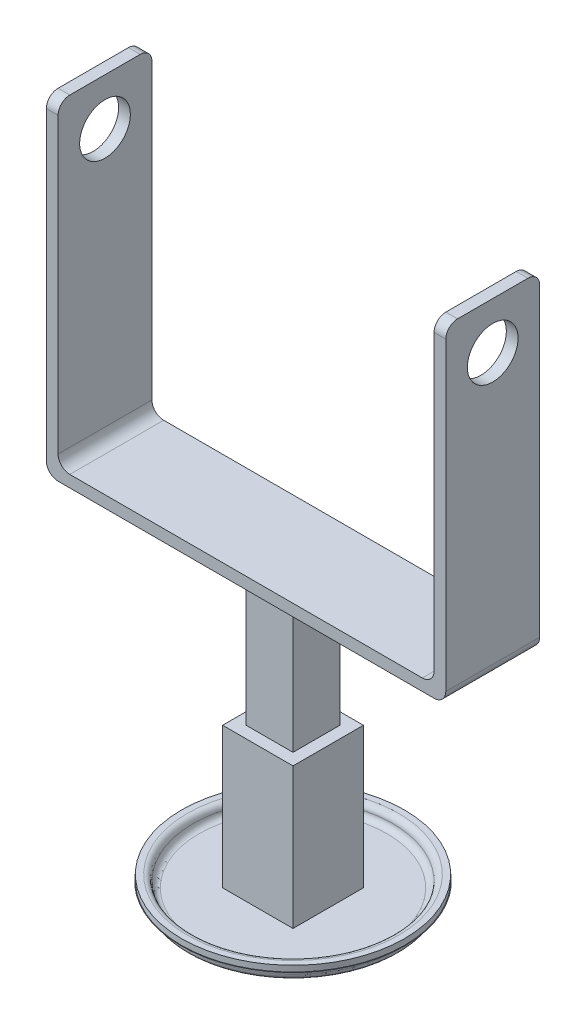
ISO-10303-21;
HEADER;
FILE_DESCRIPTION(('STEP AP214'),'2;1');
FILE_NAME('part.step','',(''),(''),'','','');
FILE_SCHEMA(('AUTOMOTIVE_DESIGN { 1 0 10303 214 1 1 1 1 }'));
ENDSEC;
DATA;
#1=APPLICATION_CONTEXT('core data for automotive mechanical design processes');
#2=APPLICATION_PROTOCOL_DEFINITION('international standard','automotive_design',2000,#1);
#3=PRODUCT_CONTEXT('',#1,'mechanical');
#4=PRODUCT('Part','Part','',(#3));
#5=PRODUCT_RELATED_PRODUCT_CATEGORY('part','',(#4));
#6=PRODUCT_DEFINITION_FORMATION('','',#4);
#7=PRODUCT_DEFINITION_CONTEXT('part definition',#1,'design');
#8=PRODUCT_DEFINITION('design','',#6,#7);
#9=PRODUCT_DEFINITION_SHAPE('','',#8);
#10=(LENGTH_UNIT() NAMED_UNIT(*) SI_UNIT(.MILLI.,.METRE.));
#11=(NAMED_UNIT(*) PLANE_ANGLE_UNIT() SI_UNIT($,.RADIAN.));
#12=(NAMED_UNIT(*) SI_UNIT($,.STERADIAN.) SOLID_ANGLE_UNIT());
#13=UNCERTAINTY_MEASURE_WITH_UNIT(LENGTH_MEASURE(1.E-05),#10,'distance_accuracy_value','');
#14=(GEOMETRIC_REPRESENTATION_CONTEXT(3) GLOBAL_UNCERTAINTY_ASSIGNED_CONTEXT((#13)) GLOBAL_UNIT_ASSIGNED_CONTEXT((#10,
#11,#12)) REPRESENTATION_CONTEXT('',''));
#15=CARTESIAN_POINT('',(0.,0.,0.));
#16=DIRECTION('',(0.,0.,1.));
#17=DIRECTION('',(1.,0.,0.));
#18=AXIS2_PLACEMENT_3D('',#15,#16,#17);
#19=CARTESIAN_POINT('',(0.,79.375,0.));
#20=DIRECTION('',(0.,-1.,0.));
#21=DIRECTION('',(1.,0.,0.));
#22=AXIS2_PLACEMENT_3D('',#19,#20,#21);
#23=PLANE('',#22);
#24=DIRECTION('',(0.,0.,1.));
#25=VECTOR('',#24,1.);
#26=CARTESIAN_POINT('',(-19.0499999999999,79.3750000000001,-19.05));
#27=LINE('',#26,#25);
#28=CARTESIAN_POINT('',(-19.0499999999999,79.3750000000001,-19.05));
#29=VERTEX_POINT('',#28);
#30=CARTESIAN_POINT('',(-19.0499999999999,79.3750000000001,19.05));
#31=VERTEX_POINT('',#30);
#32=EDGE_CURVE('E703',#29,#31,#27,.T.);
#33=ORIENTED_EDGE('',*,*,#32,.T.);
#34=DIRECTION('',(1.,0.,0.));
#35=VECTOR('',#34,1.);
#36=CARTESIAN_POINT('',(19.0500000000001,79.375,19.05));
#37=LINE('',#36,#35);
#38=CARTESIAN_POINT('',(19.0500000000001,79.375,19.05));
#39=VERTEX_POINT('',#38);
#40=EDGE_CURVE('E699',#31,#39,#37,.T.);
#41=ORIENTED_EDGE('',*,*,#40,.T.);
#42=DIRECTION('',(0.,0.,-1.));
#43=VECTOR('',#42,1.);
#44=CARTESIAN_POINT('',(19.0500000000001,79.375,-19.05));
#45=LINE('',#44,#43);
#46=CARTESIAN_POINT('',(19.0500000000001,79.375,-19.05));
#47=VERTEX_POINT('',#46);
#48=EDGE_CURVE('E702',#39,#47,#45,.T.);
#49=ORIENTED_EDGE('',*,*,#48,.T.);
#50=DIRECTION('',(-1.,0.,0.));
#51=VECTOR('',#50,1.);
#52=CARTESIAN_POINT('',(19.0500000000001,79.375,-19.05));
#53=LINE('',#52,#51);
#54=EDGE_CURVE('E707',#47,#29,#53,.T.);
#55=ORIENTED_EDGE('',*,*,#54,.T.);
#56=EDGE_LOOP('',(#33,#41,#49,#55));
#57=FACE_BOUND('',#56,.T.);
#58=DIRECTION('',(0.,0.,1.));
#59=VECTOR('',#58,1.);
#60=CARTESIAN_POINT('',(-12.6999999999999,79.375,-12.7));
#61=LINE('',#60,#59);
#62=CARTESIAN_POINT('',(-12.6999999999999,79.375,-12.7));
#63=VERTEX_POINT('',#62);
#64=CARTESIAN_POINT('',(-12.6999999999999,79.375,12.7));
#65=VERTEX_POINT('',#64);
#66=EDGE_CURVE('E295',#63,#65,#61,.T.);
#67=ORIENTED_EDGE('',*,*,#66,.F.);
#68=DIRECTION('',(-1.,0.,0.));
#69=VECTOR('',#68,1.);
#70=CARTESIAN_POINT('',(12.7000000000001,79.375,-12.7));
#71=LINE('',#70,#69);
#72=CARTESIAN_POINT('',(12.7000000000001,79.375,-12.7));
#73=VERTEX_POINT('',#72);
#74=EDGE_CURVE('E271',#73,#63,#71,.T.);
#75=ORIENTED_EDGE('',*,*,#74,.F.);
#76=DIRECTION('',(0.,0.,-1.));
#77=VECTOR('',#76,1.);
#78=CARTESIAN_POINT('',(12.7000000000001,79.375,-12.7));
#79=LINE('',#78,#77);
#80=CARTESIAN_POINT('',(12.7000000000001,79.375,12.7));
#81=VERTEX_POINT('',#80);
#82=EDGE_CURVE('E751',#81,#73,#79,.T.);
#83=ORIENTED_EDGE('',*,*,#82,.F.);
#84=DIRECTION('',(1.,0.,0.));
#85=VECTOR('',#84,1.);
#86=CARTESIAN_POINT('',(12.7000000000001,79.375,12.7));
#87=LINE('',#86,#85);
#88=EDGE_CURVE('E753',#65,#81,#87,.T.);
#89=ORIENTED_EDGE('',*,*,#88,.F.);
#90=EDGE_LOOP('',(#67,#75,#83,#89));
#91=FACE_BOUND('',#90,.T.);
#92=ADVANCED_FACE('F45',(#57,#91),#23,.F.);
#93=CARTESIAN_POINT('',(50.8,3.17499999999998,0.));
#94=DIRECTION('',(0.,-1.,0.));
#95=DIRECTION('',(1.,0.,0.));
#96=AXIS2_PLACEMENT_3D('',#93,#94,#95);
#97=PLANE('',#96);
#98=CARTESIAN_POINT('',(0.,3.17500000000006,0.));
#99=DIRECTION('',(0.,1.,0.));
#100=DIRECTION('',(-1.,0.,0.));
#101=AXIS2_PLACEMENT_3D('',#98,#99,#100);
#102=CIRCLE('',#101,50.8);
#103=CARTESIAN_POINT('',(-50.8,3.17500000000012,0.));
#104=VERTEX_POINT('',#103);
#105=EDGE_CURVE('E696',#104,#104,#102,.T.);
#106=ORIENTED_EDGE('',*,*,#105,.T.);
#107=EDGE_LOOP('',(#106));
#108=FACE_BOUND('',#107,.T.);
#109=DIRECTION('',(0.,0.,1.));
#110=VECTOR('',#109,1.);
#111=CARTESIAN_POINT('',(-19.05,3.17500000000005,-19.05));
#112=LINE('',#111,#110);
#113=CARTESIAN_POINT('',(-19.05,3.17500000000005,-19.05));
#114=VERTEX_POINT('',#113);
#115=CARTESIAN_POINT('',(-19.05,3.17500000000005,19.05));
#116=VERTEX_POINT('',#115);
#117=EDGE_CURVE('E663',#114,#116,#112,.T.);
#118=ORIENTED_EDGE('',*,*,#117,.F.);
#119=DIRECTION('',(-1.,0.,0.));
#120=VECTOR('',#119,1.);
#121=CARTESIAN_POINT('',(19.05,3.17500000000001,-19.05));
#122=LINE('',#121,#120);
#123=CARTESIAN_POINT('',(19.0500000000001,3.17500000000001,-19.05));
#124=VERTEX_POINT('',#123);
#125=EDGE_CURVE('E670',#124,#114,#122,.T.);
#126=ORIENTED_EDGE('',*,*,#125,.F.);
#127=DIRECTION('',(0.,0.,-1.));
#128=VECTOR('',#127,1.);
#129=CARTESIAN_POINT('',(19.05,3.17500000000001,-19.05));
#130=LINE('',#129,#128);
#131=CARTESIAN_POINT('',(19.05,3.17500000000001,19.05));
#132=VERTEX_POINT('',#131);
#133=EDGE_CURVE('E662',#132,#124,#130,.T.);
#134=ORIENTED_EDGE('',*,*,#133,.F.);
#135=DIRECTION('',(1.,0.,0.));
#136=VECTOR('',#135,1.);
#137=CARTESIAN_POINT('',(19.05,3.17500000000001,19.05));
#138=LINE('',#137,#136);
#139=EDGE_CURVE('E656',#116,#132,#138,.T.);
#140=ORIENTED_EDGE('',*,*,#139,.F.);
#141=EDGE_LOOP('',(#118,#126,#134,#140));
#142=FACE_BOUND('',#141,.T.);
#143=ADVANCED_FACE('F740',(#108,#142),#97,.F.);
#144=CARTESIAN_POINT('',(0.,0.,0.));
#145=DIRECTION('',(0.,1.,0.));
#146=DIRECTION('',(-1.,0.,0.));
#147=AXIS2_PLACEMENT_3D('',#144,#145,#146);
#148=PLANE('',#147);
#149=CARTESIAN_POINT('',(0.,0.,0.));
#150=DIRECTION('',(0.,1.,0.));
#151=DIRECTION('',(-1.,0.,0.));
#152=AXIS2_PLACEMENT_3D('',#149,#150,#151);
#153=CIRCLE('',#152,54.2616930789836);
#154=CARTESIAN_POINT('',(-54.2616930789836,1.19654227792144E-13,0.));
#155=VERTEX_POINT('',#154);
#156=EDGE_CURVE('E626',#155,#155,#153,.T.);
#157=ORIENTED_EDGE('',*,*,#156,.F.);
#158=EDGE_LOOP('',(#157));
#159=FACE_BOUND('',#158,.T.);
#160=ADVANCED_FACE('F796',(#159),#148,.F.);
#161=CARTESIAN_POINT('',(0.,3.17500000000006,0.));
#162=DIRECTION('',(0.,1.,0.));
#163=DIRECTION('',(-1.,0.,0.));
#164=AXIS2_PLACEMENT_3D('',#161,#162,#163);
#165=TOROIDAL_SURFACE('',#164,54.2616930789836,3.175);
#166=CARTESIAN_POINT('',(0.,3.17500000000006,0.));
#167=DIRECTION('',(0.,1.,0.));
#168=DIRECTION('',(-1.,0.,0.));
#169=AXIS2_PLACEMENT_3D('',#166,#167,#168);
#170=CIRCLE('',#169,57.4366930789836);
#171=CARTESIAN_POINT('',(-57.4366930789836,3.17500000000013,0.));
#172=VERTEX_POINT('',#171);
#173=EDGE_CURVE('E622',#172,#172,#170,.T.);
#174=ORIENTED_EDGE('',*,*,#173,.F.);
#175=EDGE_LOOP('',(#174));
#176=FACE_BOUND('',#175,.T.);
#177=ORIENTED_EDGE('',*,*,#156,.T.);
#178=EDGE_LOOP('',(#177));
#179=FACE_BOUND('',#178,.T.);
#180=ADVANCED_FACE('F850',(#176,#179),#165,.T.);
#181=CARTESIAN_POINT('',(0.,3.17500000000007,0.));
#182=DIRECTION('',(0.,1.,0.));
#183=DIRECTION('',(-1.,0.,0.));
#184=AXIS2_PLACEMENT_3D('',#181,#182,#183);
#185=TOROIDAL_SURFACE('',#184,60.6116930789836,3.175);
#186=CARTESIAN_POINT('',(0.,6.35000000000007,0.));
#187=DIRECTION('',(0.,1.,0.));
#188=DIRECTION('',(-1.,0.,0.));
#189=AXIS2_PLACEMENT_3D('',#186,#187,#188);
#190=CIRCLE('',#189,60.6116930789836);
#191=CARTESIAN_POINT('',(-60.6116930789836,6.35000000000014,0.));
#192=VERTEX_POINT('',#191);
#193=EDGE_CURVE('E618',#192,#192,#190,.T.);
#194=ORIENTED_EDGE('',*,*,#193,.F.);
#195=EDGE_LOOP('',(#194));
#196=FACE_BOUND('',#195,.T.);
#197=ORIENTED_EDGE('',*,*,#173,.T.);
#198=EDGE_LOOP('',(#197));
#199=FACE_BOUND('',#198,.T.);
#200=ADVANCED_FACE('F845',(#196,#199),#185,.F.);
#201=CARTESIAN_POINT('',(60.6116930789836,6.35,0.));
#202=DIRECTION('',(0.,-1.,0.));
#203=DIRECTION('',(1.,0.,0.));
#204=AXIS2_PLACEMENT_3D('',#201,#202,#203);
#205=PLANE('',#204);
#206=CARTESIAN_POINT('',(0.,6.35000000000007,0.));
#207=DIRECTION('',(0.,1.,0.));
#208=DIRECTION('',(-1.,0.,0.));
#209=AXIS2_PLACEMENT_3D('',#206,#207,#208);
#210=CIRCLE('',#209,60.325);
#211=CARTESIAN_POINT('',(-60.325,6.35000000000014,0.));
#212=VERTEX_POINT('',#211);
#213=EDGE_CURVE('E613',#212,#212,#210,.T.);
#214=ORIENTED_EDGE('',*,*,#213,.F.);
#215=EDGE_LOOP('',(#214));
#216=FACE_BOUND('',#215,.T.);
#217=ORIENTED_EDGE('',*,*,#193,.T.);
#218=EDGE_LOOP('',(#217));
#219=FACE_BOUND('',#218,.T.);
#220=ADVANCED_FACE('F841',(#216,#219),#205,.F.);
#221=CARTESIAN_POINT('',(0.,3.175,0.));
#222=DIRECTION('',(0.,1.,0.));
#223=DIRECTION('',(-1.,0.,0.));
#224=AXIS2_PLACEMENT_3D('',#221,#222,#223);
#225=CYLINDRICAL_SURFACE('',#224,60.325);
#226=CARTESIAN_POINT('',(0.,9.52500000000007,0.));
#227=DIRECTION('',(0.,1.,0.));
#228=DIRECTION('',(-1.,0.,0.));
#229=AXIS2_PLACEMENT_3D('',#226,#227,#228);
#230=CIRCLE('',#229,60.325);
#231=CARTESIAN_POINT('',(-60.325,9.52500000000014,0.));
#232=VERTEX_POINT('',#231);
#233=EDGE_CURVE('E610',#232,#232,#230,.T.);
#234=ORIENTED_EDGE('',*,*,#233,.F.);
#235=EDGE_LOOP('',(#234));
#236=FACE_BOUND('',#235,.T.);
#237=ORIENTED_EDGE('',*,*,#213,.T.);
#238=EDGE_LOOP('',(#237));
#239=FACE_BOUND('',#238,.T.);
#240=ADVANCED_FACE('F836',(#236,#239),#225,.T.);
#241=CARTESIAN_POINT('',(60.325,9.525,0.));
#242=DIRECTION('',(0.,-1.,0.));
#243=DIRECTION('',(1.,0.,0.));
#244=AXIS2_PLACEMENT_3D('',#241,#242,#243);
#245=PLANE('',#244);
#246=CARTESIAN_POINT('',(0.,9.52500000000007,0.));
#247=DIRECTION('',(0.,1.,0.));
#248=DIRECTION('',(-1.,0.,0.));
#249=AXIS2_PLACEMENT_3D('',#246,#247,#248);
#250=CIRCLE('',#249,57.15);
#251=CARTESIAN_POINT('',(-57.15,9.52500000000013,0.));
#252=VERTEX_POINT('',#251);
#253=EDGE_CURVE('E614',#252,#252,#250,.T.);
#254=ORIENTED_EDGE('',*,*,#253,.F.);
#255=EDGE_LOOP('',(#254));
#256=FACE_BOUND('',#255,.T.);
#257=ORIENTED_EDGE('',*,*,#233,.T.);
#258=EDGE_LOOP('',(#257));
#259=FACE_BOUND('',#258,.T.);
#260=ADVANCED_FACE('F831',(#256,#259),#245,.F.);
#261=CARTESIAN_POINT('',(0.,6.35000000000007,0.));
#262=DIRECTION('',(0.,1.,0.));
#263=DIRECTION('',(-1.,0.,0.));
#264=AXIS2_PLACEMENT_3D('',#261,#262,#263);
#265=TOROIDAL_SURFACE('',#264,57.15,3.175);
#266=CARTESIAN_POINT('',(0.,6.35000000000006,0.));
#267=DIRECTION('',(0.,1.,0.));
#268=DIRECTION('',(-1.,0.,0.));
#269=AXIS2_PLACEMENT_3D('',#266,#267,#268);
#270=CIRCLE('',#269,53.975);
#271=CARTESIAN_POINT('',(-53.975,6.35000000000012,0.));
#272=VERTEX_POINT('',#271);
#273=EDGE_CURVE('E648',#272,#272,#270,.T.);
#274=ORIENTED_EDGE('',*,*,#273,.F.);
#275=EDGE_LOOP('',(#274));
#276=FACE_BOUND('',#275,.T.);
#277=ORIENTED_EDGE('',*,*,#253,.T.);
#278=EDGE_LOOP('',(#277));
#279=FACE_BOUND('',#278,.T.);
#280=ADVANCED_FACE('F827',(#276,#279),#265,.T.);
#281=CARTESIAN_POINT('',(0.,6.35000000000006,0.));
#282=DIRECTION('',(0.,1.,0.));
#283=DIRECTION('',(-1.,0.,0.));
#284=AXIS2_PLACEMENT_3D('',#281,#282,#283);
#285=TOROIDAL_SURFACE('',#284,50.8,3.175);
#286=ORIENTED_EDGE('',*,*,#105,.F.);
#287=EDGE_LOOP('',(#286));
#288=FACE_BOUND('',#287,.T.);
#289=ORIENTED_EDGE('',*,*,#273,.T.);
#290=EDGE_LOOP('',(#289));
#291=FACE_BOUND('',#290,.T.);
#292=ADVANCED_FACE('F822',(#288,#291),#285,.F.);
#293=CARTESIAN_POINT('',(-19.0499999999999,79.3750000000001,-19.05));
#294=DIRECTION('',(1.,0.,0.));
#295=DIRECTION('',(0.,1.,0.));
#296=AXIS2_PLACEMENT_3D('',#293,#294,#295);
#297=PLANE('',#296);
#298=ORIENTED_EDGE('',*,*,#117,.T.);
#299=DIRECTION('',(0.,-1.,0.));
#300=VECTOR('',#299,1.);
#301=CARTESIAN_POINT('',(-19.0499999999999,79.3750000000001,19.05));
#302=LINE('',#301,#300);
#303=EDGE_CURVE('E692',#31,#116,#302,.T.);
#304=ORIENTED_EDGE('',*,*,#303,.F.);
#305=ORIENTED_EDGE('',*,*,#32,.F.);
#306=DIRECTION('',(0.,-1.,0.));
#307=VECTOR('',#306,1.);
#308=CARTESIAN_POINT('',(-19.0499999999999,79.3750000000001,-19.05));
#309=LINE('',#308,#307);
#310=EDGE_CURVE('E686',#29,#114,#309,.T.);
#311=ORIENTED_EDGE('',*,*,#310,.T.);
#312=EDGE_LOOP('',(#298,#304,#305,#311));
#313=FACE_BOUND('',#312,.T.);
#314=ADVANCED_FACE('F723',(#313),#297,.F.);
#315=CARTESIAN_POINT('',(19.0500000000001,79.375,19.05));
#316=DIRECTION('',(0.,0.,-1.));
#317=DIRECTION('',(-1.,0.,0.));
#318=AXIS2_PLACEMENT_3D('',#315,#316,#317);
#319=PLANE('',#318);
#320=ORIENTED_EDGE('',*,*,#139,.T.);
#321=DIRECTION('',(0.,-1.,0.));
#322=VECTOR('',#321,1.);
#323=CARTESIAN_POINT('',(19.0500000000001,79.375,19.05));
#324=LINE('',#323,#322);
#325=EDGE_CURVE('E685',#39,#132,#324,.T.);
#326=ORIENTED_EDGE('',*,*,#325,.F.);
#327=ORIENTED_EDGE('',*,*,#40,.F.);
#328=ORIENTED_EDGE('',*,*,#303,.T.);
#329=EDGE_LOOP('',(#320,#326,#327,#328));
#330=FACE_BOUND('',#329,.T.);
#331=ADVANCED_FACE('F736',(#330),#319,.F.);
#332=CARTESIAN_POINT('',(19.0500000000001,79.375,-19.05));
#333=DIRECTION('',(-1.,0.,0.));
#334=DIRECTION('',(0.,-1.,0.));
#335=AXIS2_PLACEMENT_3D('',#332,#333,#334);
#336=PLANE('',#335);
#337=ORIENTED_EDGE('',*,*,#133,.T.);
#338=DIRECTION('',(0.,-1.,0.));
#339=VECTOR('',#338,1.);
#340=CARTESIAN_POINT('',(19.0500000000001,79.375,-19.05));
#341=LINE('',#340,#339);
#342=EDGE_CURVE('E681',#47,#124,#341,.T.);
#343=ORIENTED_EDGE('',*,*,#342,.F.);
#344=ORIENTED_EDGE('',*,*,#48,.F.);
#345=ORIENTED_EDGE('',*,*,#325,.T.);
#346=EDGE_LOOP('',(#337,#343,#344,#345));
#347=FACE_BOUND('',#346,.T.);
#348=ADVANCED_FACE('F739',(#347),#336,.F.);
#349=CARTESIAN_POINT('',(19.0500000000001,79.375,-19.05));
#350=DIRECTION('',(0.,0.,1.));
#351=DIRECTION('',(1.,0.,0.));
#352=AXIS2_PLACEMENT_3D('',#349,#350,#351);
#353=PLANE('',#352);
#354=ORIENTED_EDGE('',*,*,#125,.T.);
#355=ORIENTED_EDGE('',*,*,#310,.F.);
#356=ORIENTED_EDGE('',*,*,#54,.F.);
#357=ORIENTED_EDGE('',*,*,#342,.T.);
#358=EDGE_LOOP('',(#354,#355,#356,#357));
#359=FACE_BOUND('',#358,.T.);
#360=ADVANCED_FACE('F727',(#359),#353,.F.);
#361=CARTESIAN_POINT('',(-12.6999999999998,155.575,-12.7));
#362=DIRECTION('',(1.,0.,0.));
#363=DIRECTION('',(0.,1.,0.));
#364=AXIS2_PLACEMENT_3D('',#361,#362,#363);
#365=PLANE('',#364);
#366=ORIENTED_EDGE('',*,*,#66,.T.);
#367=DIRECTION('',(0.,-1.,0.));
#368=VECTOR('',#367,1.);
#369=CARTESIAN_POINT('',(-12.6999999999998,155.575,12.7));
#370=LINE('',#369,#368);
#371=CARTESIAN_POINT('',(-12.6999999999998,155.575,12.7));
#372=VERTEX_POINT('',#371);
#373=EDGE_CURVE('E265',#372,#65,#370,.T.);
#374=ORIENTED_EDGE('',*,*,#373,.F.);
#375=DIRECTION('',(0.,0.,1.));
#376=VECTOR('',#375,1.);
#377=CARTESIAN_POINT('',(-12.6999999999998,155.575,-12.7));
#378=LINE('',#377,#376);
#379=CARTESIAN_POINT('',(-12.6999999999998,155.575,-12.7));
#380=VERTEX_POINT('',#379);
#381=EDGE_CURVE('E259',#380,#372,#378,.T.);
#382=ORIENTED_EDGE('',*,*,#381,.F.);
#383=DIRECTION('',(0.,-1.,0.));
#384=VECTOR('',#383,1.);
#385=CARTESIAN_POINT('',(-12.6999999999998,155.575,-12.7));
#386=LINE('',#385,#384);
#387=EDGE_CURVE('E263',#380,#63,#386,.T.);
#388=ORIENTED_EDGE('',*,*,#387,.T.);
#389=EDGE_LOOP('',(#366,#374,#382,#388));
#390=FACE_BOUND('',#389,.T.);
#391=ADVANCED_FACE('F262',(#390),#365,.F.);
#392=CARTESIAN_POINT('',(12.7000000000002,155.575,12.7));
#393=DIRECTION('',(0.,0.,-1.));
#394=DIRECTION('',(-1.,0.,0.));
#395=AXIS2_PLACEMENT_3D('',#392,#393,#394);
#396=PLANE('',#395);
#397=ORIENTED_EDGE('',*,*,#88,.T.);
#398=DIRECTION('',(0.,-1.,0.));
#399=VECTOR('',#398,1.);
#400=CARTESIAN_POINT('',(12.7000000000002,155.575,12.7));
#401=LINE('',#400,#399);
#402=CARTESIAN_POINT('',(12.7000000000002,155.575,12.7));
#403=VERTEX_POINT('',#402);
#404=EDGE_CURVE('E326',#403,#81,#401,.T.);
#405=ORIENTED_EDGE('',*,*,#404,.F.);
#406=DIRECTION('',(1.,0.,0.));
#407=VECTOR('',#406,1.);
#408=CARTESIAN_POINT('',(12.7000000000002,155.575,12.7));
#409=LINE('',#408,#407);
#410=EDGE_CURVE('E270',#372,#403,#409,.T.);
#411=ORIENTED_EDGE('',*,*,#410,.F.);
#412=ORIENTED_EDGE('',*,*,#373,.T.);
#413=EDGE_LOOP('',(#397,#405,#411,#412));
#414=FACE_BOUND('',#413,.T.);
#415=ADVANCED_FACE('F752',(#414),#396,.F.);
#416=CARTESIAN_POINT('',(12.7000000000002,155.575,-12.7));
#417=DIRECTION('',(-1.,0.,0.));
#418=DIRECTION('',(0.,-1.,0.));
#419=AXIS2_PLACEMENT_3D('',#416,#417,#418);
#420=PLANE('',#419);
#421=ORIENTED_EDGE('',*,*,#82,.T.);
#422=DIRECTION('',(0.,-1.,0.));
#423=VECTOR('',#422,1.);
#424=CARTESIAN_POINT('',(12.7000000000002,155.575,-12.7));
#425=LINE('',#424,#423);
#426=CARTESIAN_POINT('',(12.7000000000002,155.575,-12.7));
#427=VERTEX_POINT('',#426);
#428=EDGE_CURVE('E281',#427,#73,#425,.T.);
#429=ORIENTED_EDGE('',*,*,#428,.F.);
#430=DIRECTION('',(0.,0.,-1.));
#431=VECTOR('',#430,1.);
#432=CARTESIAN_POINT('',(12.7000000000002,155.575,-12.7));
#433=LINE('',#432,#431);
#434=EDGE_CURVE('E285',#403,#427,#433,.T.);
#435=ORIENTED_EDGE('',*,*,#434,.F.);
#436=ORIENTED_EDGE('',*,*,#404,.T.);
#437=EDGE_LOOP('',(#421,#429,#435,#436));
#438=FACE_BOUND('',#437,.T.);
#439=ADVANCED_FACE('F750',(#438),#420,.F.);
#440=CARTESIAN_POINT('',(12.7000000000002,155.575,-12.7));
#441=DIRECTION('',(0.,0.,1.));
#442=DIRECTION('',(1.,0.,0.));
#443=AXIS2_PLACEMENT_3D('',#440,#441,#442);
#444=PLANE('',#443);
#445=ORIENTED_EDGE('',*,*,#74,.T.);
#446=ORIENTED_EDGE('',*,*,#387,.F.);
#447=DIRECTION('',(-1.,0.,0.));
#448=VECTOR('',#447,1.);
#449=CARTESIAN_POINT('',(12.7000000000002,155.575,-12.7));
#450=LINE('',#449,#448);
#451=EDGE_CURVE('E278',#427,#380,#450,.T.);
#452=ORIENTED_EDGE('',*,*,#451,.F.);
#453=ORIENTED_EDGE('',*,*,#428,.T.);
#454=EDGE_LOOP('',(#445,#446,#452,#453));
#455=FACE_BOUND('',#454,.T.);
#456=ADVANCED_FACE('F276',(#455),#444,.F.);
#457=CARTESIAN_POINT('',(108.077,155.575,25.4));
#458=DIRECTION('',(0.,1.,0.));
#459=DIRECTION('',(-1.,0.,0.));
#460=AXIS2_PLACEMENT_3D('',#457,#458,#459);
#461=PLANE('',#460);
#462=DIRECTION('',(1.,0.,0.));
#463=VECTOR('',#462,1.);
#464=CARTESIAN_POINT('',(108.077,155.575,25.4));
#465=LINE('',#464,#463);
#466=CARTESIAN_POINT('',(-101.727,155.575,25.4));
#467=VERTEX_POINT('',#466);
#468=CARTESIAN_POINT('',(101.727,155.575,25.4));
#469=VERTEX_POINT('',#468);
#470=EDGE_CURVE('E376',#467,#469,#465,.T.);
#471=ORIENTED_EDGE('',*,*,#470,.F.);
#472=DIRECTION('',(0.,0.,-1.));
#473=VECTOR('',#472,1.);
#474=CARTESIAN_POINT('',(-101.727,155.575,25.4));
#475=LINE('',#474,#473);
#476=CARTESIAN_POINT('',(-101.727,155.575,-25.4));
#477=VERTEX_POINT('',#476);
#478=EDGE_CURVE('E456',#467,#477,#475,.T.);
#479=ORIENTED_EDGE('',*,*,#478,.T.);
#480=DIRECTION('',(1.,0.,0.));
#481=VECTOR('',#480,1.);
#482=CARTESIAN_POINT('',(108.077,155.575,-25.4));
#483=LINE('',#482,#481);
#484=CARTESIAN_POINT('',(101.727,155.575,-25.4));
#485=VERTEX_POINT('',#484);
#486=EDGE_CURVE('E423',#477,#485,#483,.T.);
#487=ORIENTED_EDGE('',*,*,#486,.T.);
#488=DIRECTION('',(0.,0.,-1.));
#489=VECTOR('',#488,1.);
#490=CARTESIAN_POINT('',(101.727,155.575,25.4));
#491=LINE('',#490,#489);
#492=EDGE_CURVE('E453',#485,#469,#491,.F.);
#493=ORIENTED_EDGE('',*,*,#492,.T.);
#494=EDGE_LOOP('',(#471,#479,#487,#493));
#495=FACE_BOUND('',#494,.T.);
#496=ORIENTED_EDGE('',*,*,#451,.T.);
#497=ORIENTED_EDGE('',*,*,#381,.T.);
#498=ORIENTED_EDGE('',*,*,#410,.T.);
#499=ORIENTED_EDGE('',*,*,#434,.T.);
#500=EDGE_LOOP('',(#496,#497,#498,#499));
#501=FACE_BOUND('',#500,.T.);
#502=ADVANCED_FACE('F283',(#495,#501),#461,.F.);
#503=CARTESIAN_POINT('',(-108.077,333.375,25.4));
#504=DIRECTION('',(0.,-1.,0.));
#505=DIRECTION('',(0.,0.,-1.));
#506=AXIS2_PLACEMENT_3D('',#503,#504,#505);
#507=PLANE('',#506);
#508=DIRECTION('',(0.,0.,-1.));
#509=VECTOR('',#508,1.);
#510=CARTESIAN_POINT('',(-101.727,333.375,25.4));
#511=LINE('',#510,#509);
#512=CARTESIAN_POINT('',(-101.727,333.375,19.05));
#513=VERTEX_POINT('',#512);
#514=CARTESIAN_POINT('',(-101.727,333.375,-19.05));
#515=VERTEX_POINT('',#514);
#516=EDGE_CURVE('E346',#513,#515,#511,.T.);
#517=ORIENTED_EDGE('',*,*,#516,.T.);
#518=DIRECTION('',(-1.,0.,0.));
#519=VECTOR('',#518,1.);
#520=CARTESIAN_POINT('',(-108.077,333.375,-19.05));
#521=LINE('',#520,#519);
#522=CARTESIAN_POINT('',(-108.077,333.375,-19.05));
#523=VERTEX_POINT('',#522);
#524=EDGE_CURVE('E494',#515,#523,#521,.T.);
#525=ORIENTED_EDGE('',*,*,#524,.T.);
#526=DIRECTION('',(0.,0.,-1.));
#527=VECTOR('',#526,1.);
#528=CARTESIAN_POINT('',(-108.077,333.375,25.4));
#529=LINE('',#528,#527);
#530=CARTESIAN_POINT('',(-108.077,333.375,19.05));
#531=VERTEX_POINT('',#530);
#532=EDGE_CURVE('E309',#531,#523,#529,.T.);
#533=ORIENTED_EDGE('',*,*,#532,.F.);
#534=DIRECTION('',(-1.,0.,0.));
#535=VECTOR('',#534,1.);
#536=CARTESIAN_POINT('',(-108.077,333.375,19.05));
#537=LINE('',#536,#535);
#538=EDGE_CURVE('E490',#531,#513,#537,.F.);
#539=ORIENTED_EDGE('',*,*,#538,.T.);
#540=EDGE_LOOP('',(#517,#525,#533,#539));
#541=FACE_BOUND('',#540,.T.);
#542=ADVANCED_FACE('F764',(#541),#507,.F.);
#543=CARTESIAN_POINT('',(-108.077,155.575,25.4));
#544=DIRECTION('',(1.,0.,0.));
#545=DIRECTION('',(0.,0.,-1.));
#546=AXIS2_PLACEMENT_3D('',#543,#544,#545);
#547=PLANE('',#546);
#548=CARTESIAN_POINT('',(-108.077,307.975,0.));
#549=DIRECTION('',(1.,0.,0.));
#550=DIRECTION('',(0.,0.,-1.));
#551=AXIS2_PLACEMENT_3D('',#548,#549,#550);
#552=CIRCLE('',#551,13.716);
#553=CARTESIAN_POINT('',(-108.077,307.975,-13.716));
#554=VERTEX_POINT('',#553);
#555=EDGE_CURVE('E539',#554,#554,#552,.T.);
#556=ORIENTED_EDGE('',*,*,#555,.T.);
#557=EDGE_LOOP('',(#556));
#558=FACE_BOUND('',#557,.T.);
#559=ORIENTED_EDGE('',*,*,#532,.T.);
#560=CARTESIAN_POINT('',(-108.077,327.025,-19.05));
#561=DIRECTION('',(1.,0.,0.));
#562=DIRECTION('',(0.,0.,-1.));
#563=AXIS2_PLACEMENT_3D('',#560,#561,#562);
#564=CIRCLE('',#563,6.35);
#565=CARTESIAN_POINT('',(-108.077,327.025,-25.4));
#566=VERTEX_POINT('',#565);
#567=EDGE_CURVE('E502',#523,#566,#564,.F.);
#568=ORIENTED_EDGE('',*,*,#567,.T.);
#569=DIRECTION('',(0.,-1.,0.));
#570=VECTOR('',#569,1.);
#571=CARTESIAN_POINT('',(-108.077,155.575,-25.4));
#572=LINE('',#571,#570);
#573=CARTESIAN_POINT('',(-108.077,161.925,-25.4));
#574=VERTEX_POINT('',#573);
#575=EDGE_CURVE('E370',#566,#574,#572,.T.);
#576=ORIENTED_EDGE('',*,*,#575,.T.);
#577=DIRECTION('',(0.,0.,-1.));
#578=VECTOR('',#577,1.);
#579=CARTESIAN_POINT('',(-108.077,161.925,25.4));
#580=LINE('',#579,#578);
#581=CARTESIAN_POINT('',(-108.077,161.925,25.4));
#582=VERTEX_POINT('',#581);
#583=EDGE_CURVE('E594',#574,#582,#580,.F.);
#584=ORIENTED_EDGE('',*,*,#583,.T.);
#585=DIRECTION('',(0.,-1.,0.));
#586=VECTOR('',#585,1.);
#587=CARTESIAN_POINT('',(-108.077,155.575,25.4));
#588=LINE('',#587,#586);
#589=CARTESIAN_POINT('',(-108.077,327.025,25.4));
#590=VERTEX_POINT('',#589);
#591=EDGE_CURVE('E342',#590,#582,#588,.T.);
#592=ORIENTED_EDGE('',*,*,#591,.F.);
#593=CARTESIAN_POINT('',(-108.077,327.025,19.05));
#594=DIRECTION('',(1.,0.,0.));
#595=DIRECTION('',(0.,0.,-1.));
#596=AXIS2_PLACEMENT_3D('',#593,#594,#595);
#597=CIRCLE('',#596,6.35);
#598=EDGE_CURVE('E499',#590,#531,#597,.F.);
#599=ORIENTED_EDGE('',*,*,#598,.T.);
#600=EDGE_LOOP('',(#559,#568,#576,#584,#592,#599));
#601=FACE_BOUND('',#600,.T.);
#602=ADVANCED_FACE('F559',(#558,#601),#547,.F.);
#603=CARTESIAN_POINT('',(108.077,155.575,25.4));
#604=DIRECTION('',(-1.,0.,0.));
#605=DIRECTION('',(0.,-1.,0.));
#606=AXIS2_PLACEMENT_3D('',#603,#604,#605);
#607=PLANE('',#606);
#608=CARTESIAN_POINT('',(108.077,307.975,0.));
#609=DIRECTION('',(1.,0.,0.));
#610=DIRECTION('',(0.,0.,-1.));
#611=AXIS2_PLACEMENT_3D('',#608,#609,#610);
#612=CIRCLE('',#611,13.716);
#613=CARTESIAN_POINT('',(108.077,307.975,-13.716));
#614=VERTEX_POINT('',#613);
#615=EDGE_CURVE('E371',#614,#614,#612,.T.);
#616=ORIENTED_EDGE('',*,*,#615,.F.);
#617=EDGE_LOOP('',(#616));
#618=FACE_BOUND('',#617,.T.);
#619=DIRECTION('',(0.,0.,-1.));
#620=VECTOR('',#619,1.);
#621=CARTESIAN_POINT('',(108.077,333.375,25.4));
#622=LINE('',#621,#620);
#623=CARTESIAN_POINT('',(108.077,333.375,19.05));
#624=VERTEX_POINT('',#623);
#625=CARTESIAN_POINT('',(108.077,333.375,-19.05));
#626=VERTEX_POINT('',#625);
#627=EDGE_CURVE('E356',#624,#626,#622,.T.);
#628=ORIENTED_EDGE('',*,*,#627,.F.);
#629=CARTESIAN_POINT('',(108.077,327.025,19.05));
#630=DIRECTION('',(-1.,0.,0.));
#631=DIRECTION('',(0.,-1.,0.));
#632=AXIS2_PLACEMENT_3D('',#629,#630,#631);
#633=CIRCLE('',#632,6.35);
#634=CARTESIAN_POINT('',(108.077,327.025,25.4));
#635=VERTEX_POINT('',#634);
#636=EDGE_CURVE('E12',#624,#635,#633,.F.);
#637=ORIENTED_EDGE('',*,*,#636,.T.);
#638=DIRECTION('',(0.,1.,0.));
#639=VECTOR('',#638,1.);
#640=CARTESIAN_POINT('',(108.077,155.575,25.4));
#641=LINE('',#640,#639);
#642=CARTESIAN_POINT('',(108.077,161.925,25.4));
#643=VERTEX_POINT('',#642);
#644=EDGE_CURVE('E387',#643,#635,#641,.T.);
#645=ORIENTED_EDGE('',*,*,#644,.F.);
#646=DIRECTION('',(0.,0.,-1.));
#647=VECTOR('',#646,1.);
#648=CARTESIAN_POINT('',(108.077,161.925,25.4));
#649=LINE('',#648,#647);
#650=CARTESIAN_POINT('',(108.077,161.925,-25.4));
#651=VERTEX_POINT('',#650);
#652=EDGE_CURVE('E485',#643,#651,#649,.T.);
#653=ORIENTED_EDGE('',*,*,#652,.T.);
#654=DIRECTION('',(0.,1.,0.));
#655=VECTOR('',#654,1.);
#656=CARTESIAN_POINT('',(108.077,155.575,-25.4));
#657=LINE('',#656,#655);
#658=CARTESIAN_POINT('',(108.077,327.025,-25.4));
#659=VERTEX_POINT('',#658);
#660=EDGE_CURVE('E437',#651,#659,#657,.T.);
#661=ORIENTED_EDGE('',*,*,#660,.T.);
#662=CARTESIAN_POINT('',(108.077,327.025,-19.05));
#663=DIRECTION('',(-1.,0.,0.));
#664=DIRECTION('',(0.,-1.,0.));
#665=AXIS2_PLACEMENT_3D('',#662,#663,#664);
#666=CIRCLE('',#665,6.35);
#667=EDGE_CURVE('E57',#659,#626,#666,.F.);
#668=ORIENTED_EDGE('',*,*,#667,.T.);
#669=EDGE_LOOP('',(#628,#637,#645,#653,#661,#668));
#670=FACE_BOUND('',#669,.T.);
#671=ADVANCED_FACE('F556',(#618,#670),#607,.F.);
#672=CARTESIAN_POINT('',(101.727,333.375,25.4));
#673=DIRECTION('',(0.,-1.,0.));
#674=DIRECTION('',(1.,0.,0.));
#675=AXIS2_PLACEMENT_3D('',#672,#673,#674);
#676=PLANE('',#675);
#677=DIRECTION('',(0.,0.,-1.));
#678=VECTOR('',#677,1.);
#679=CARTESIAN_POINT('',(101.727,333.375,25.4));
#680=LINE('',#679,#678);
#681=CARTESIAN_POINT('',(101.727,333.375,19.05));
#682=VERTEX_POINT('',#681);
#683=CARTESIAN_POINT('',(101.727,333.375,-19.05));
#684=VERTEX_POINT('',#683);
#685=EDGE_CURVE('E351',#682,#684,#680,.T.);
#686=ORIENTED_EDGE('',*,*,#685,.F.);
#687=DIRECTION('',(-1.,0.,0.));
#688=VECTOR('',#687,1.);
#689=CARTESIAN_POINT('',(101.727,333.375,19.05));
#690=LINE('',#689,#688);
#691=EDGE_CURVE('E76',#682,#624,#690,.F.);
#692=ORIENTED_EDGE('',*,*,#691,.T.);
#693=ORIENTED_EDGE('',*,*,#627,.T.);
#694=DIRECTION('',(-1.,0.,0.));
#695=VECTOR('',#694,1.);
#696=CARTESIAN_POINT('',(101.727,333.375,-19.05));
#697=LINE('',#696,#695);
#698=EDGE_CURVE('E530',#626,#684,#697,.T.);
#699=ORIENTED_EDGE('',*,*,#698,.T.);
#700=EDGE_LOOP('',(#686,#692,#693,#699));
#701=FACE_BOUND('',#700,.T.);
#702=ADVANCED_FACE('F558',(#701),#676,.F.);
#703=CARTESIAN_POINT('',(101.727,161.925,25.4));
#704=DIRECTION('',(1.,0.,0.));
#705=DIRECTION('',(0.,0.,-1.));
#706=AXIS2_PLACEMENT_3D('',#703,#704,#705);
#707=PLANE('',#706);
#708=CARTESIAN_POINT('',(101.727,307.975,0.));
#709=DIRECTION('',(1.,0.,0.));
#710=DIRECTION('',(0.,0.,-1.));
#711=AXIS2_PLACEMENT_3D('',#708,#709,#710);
#712=CIRCLE('',#711,13.716);
#713=CARTESIAN_POINT('',(101.727,307.975,-13.716));
#714=VERTEX_POINT('',#713);
#715=EDGE_CURVE('E365',#714,#714,#712,.T.);
#716=ORIENTED_EDGE('',*,*,#715,.T.);
#717=EDGE_LOOP('',(#716));
#718=FACE_BOUND('',#717,.T.);
#719=DIRECTION('',(0.,-1.,0.));
#720=VECTOR('',#719,1.);
#721=CARTESIAN_POINT('',(101.727,161.925,25.4));
#722=LINE('',#721,#720);
#723=CARTESIAN_POINT('',(101.727,327.025,25.4));
#724=VERTEX_POINT('',#723);
#725=CARTESIAN_POINT('',(101.727,168.275,25.4));
#726=VERTEX_POINT('',#725);
#727=EDGE_CURVE('E392',#724,#726,#722,.T.);
#728=ORIENTED_EDGE('',*,*,#727,.F.);
#729=CARTESIAN_POINT('',(101.727,327.025,19.05));
#730=DIRECTION('',(1.,0.,0.));
#731=DIRECTION('',(0.,0.,-1.));
#732=AXIS2_PLACEMENT_3D('',#729,#730,#731);
#733=CIRCLE('',#732,6.35);
#734=EDGE_CURVE('E527',#724,#682,#733,.F.);
#735=ORIENTED_EDGE('',*,*,#734,.T.);
#736=ORIENTED_EDGE('',*,*,#685,.T.);
#737=CARTESIAN_POINT('',(101.727,327.025,-19.05));
#738=DIRECTION('',(1.,0.,0.));
#739=DIRECTION('',(0.,0.,-1.));
#740=AXIS2_PLACEMENT_3D('',#737,#738,#739);
#741=CIRCLE('',#740,6.35);
#742=CARTESIAN_POINT('',(101.727,327.025,-25.4));
#743=VERTEX_POINT('',#742);
#744=EDGE_CURVE('E524',#684,#743,#741,.F.);
#745=ORIENTED_EDGE('',*,*,#744,.T.);
#746=DIRECTION('',(0.,-1.,0.));
#747=VECTOR('',#746,1.);
#748=CARTESIAN_POINT('',(101.727,161.925,-25.4));
#749=LINE('',#748,#747);
#750=CARTESIAN_POINT('',(101.727,168.275,-25.4));
#751=VERTEX_POINT('',#750);
#752=EDGE_CURVE('E434',#743,#751,#749,.T.);
#753=ORIENTED_EDGE('',*,*,#752,.T.);
#754=DIRECTION('',(0.,0.,-1.));
#755=VECTOR('',#754,1.);
#756=CARTESIAN_POINT('',(101.727,168.275,25.4));
#757=LINE('',#756,#755);
#758=EDGE_CURVE('E574',#751,#726,#757,.F.);
#759=ORIENTED_EDGE('',*,*,#758,.T.);
#760=EDGE_LOOP('',(#728,#735,#736,#745,#753,#759));
#761=FACE_BOUND('',#760,.T.);
#762=ADVANCED_FACE('F572',(#718,#761),#707,.F.);
#763=CARTESIAN_POINT('',(-101.727,161.925,25.4));
#764=DIRECTION('',(0.,-1.,0.));
#765=DIRECTION('',(0.,0.,-1.));
#766=AXIS2_PLACEMENT_3D('',#763,#764,#765);
#767=PLANE('',#766);
#768=DIRECTION('',(-1.,0.,0.));
#769=VECTOR('',#768,1.);
#770=CARTESIAN_POINT('',(-101.727,161.925,-25.4));
#771=LINE('',#770,#769);
#772=CARTESIAN_POINT('',(95.3769999999999,161.925,-25.4));
#773=VERTEX_POINT('',#772);
#774=CARTESIAN_POINT('',(-95.377,161.925,-25.4));
#775=VERTEX_POINT('',#774);
#776=EDGE_CURVE('E343',#773,#775,#771,.T.);
#777=ORIENTED_EDGE('',*,*,#776,.T.);
#778=DIRECTION('',(0.,0.,-1.));
#779=VECTOR('',#778,1.);
#780=CARTESIAN_POINT('',(-95.377,161.925,25.4));
#781=LINE('',#780,#779);
#782=CARTESIAN_POINT('',(-95.377,161.925,25.4));
#783=VERTEX_POINT('',#782);
#784=EDGE_CURVE('E415',#775,#783,#781,.F.);
#785=ORIENTED_EDGE('',*,*,#784,.T.);
#786=DIRECTION('',(-1.,0.,0.));
#787=VECTOR('',#786,1.);
#788=CARTESIAN_POINT('',(-101.727,161.925,25.4));
#789=LINE('',#788,#787);
#790=CARTESIAN_POINT('',(95.3769999999999,161.925,25.4));
#791=VERTEX_POINT('',#790);
#792=EDGE_CURVE('E396',#791,#783,#789,.T.);
#793=ORIENTED_EDGE('',*,*,#792,.F.);
#794=DIRECTION('',(0.,0.,-1.));
#795=VECTOR('',#794,1.);
#796=CARTESIAN_POINT('',(95.377,161.925,-25.4));
#797=LINE('',#796,#795);
#798=EDGE_CURVE('E580',#791,#773,#797,.T.);
#799=ORIENTED_EDGE('',*,*,#798,.T.);
#800=EDGE_LOOP('',(#777,#785,#793,#799));
#801=FACE_BOUND('',#800,.T.);
#802=ADVANCED_FACE('F589',(#801),#767,.F.);
#803=CARTESIAN_POINT('',(-101.727,333.375,25.4));
#804=DIRECTION('',(-1.,0.,0.));
#805=DIRECTION('',(0.,-1.,0.));
#806=AXIS2_PLACEMENT_3D('',#803,#804,#805);
#807=PLANE('',#806);
#808=CARTESIAN_POINT('',(-101.727,307.975,0.));
#809=DIRECTION('',(-1.,0.,0.));
#810=DIRECTION('',(0.,-1.,0.));
#811=AXIS2_PLACEMENT_3D('',#808,#809,#810);
#812=CIRCLE('',#811,13.716);
#813=CARTESIAN_POINT('',(-101.727,294.259,0.));
#814=VERTEX_POINT('',#813);
#815=EDGE_CURVE('E50',#814,#814,#812,.T.);
#816=ORIENTED_EDGE('',*,*,#815,.T.);
#817=EDGE_LOOP('',(#816));
#818=FACE_BOUND('',#817,.T.);
#819=DIRECTION('',(0.,1.,0.));
#820=VECTOR('',#819,1.);
#821=CARTESIAN_POINT('',(-101.727,333.375,-25.4));
#822=LINE('',#821,#820);
#823=CARTESIAN_POINT('',(-101.727,168.275,-25.4));
#824=VERTEX_POINT('',#823);
#825=CARTESIAN_POINT('',(-101.727,327.025,-25.4));
#826=VERTEX_POINT('',#825);
#827=EDGE_CURVE('E337',#824,#826,#822,.T.);
#828=ORIENTED_EDGE('',*,*,#827,.T.);
#829=CARTESIAN_POINT('',(-101.727,327.025,-19.05));
#830=DIRECTION('',(-1.,0.,0.));
#831=DIRECTION('',(0.,-1.,0.));
#832=AXIS2_PLACEMENT_3D('',#829,#830,#831);
#833=CIRCLE('',#832,6.35);
#834=EDGE_CURVE('E513',#826,#515,#833,.F.);
#835=ORIENTED_EDGE('',*,*,#834,.T.);
#836=ORIENTED_EDGE('',*,*,#516,.F.);
#837=CARTESIAN_POINT('',(-101.727,327.025,19.05));
#838=DIRECTION('',(-1.,0.,0.));
#839=DIRECTION('',(0.,-1.,0.));
#840=AXIS2_PLACEMENT_3D('',#837,#838,#839);
#841=CIRCLE('',#840,6.35);
#842=CARTESIAN_POINT('',(-101.727,327.025,25.4));
#843=VERTEX_POINT('',#842);
#844=EDGE_CURVE('E510',#513,#843,#841,.F.);
#845=ORIENTED_EDGE('',*,*,#844,.T.);
#846=DIRECTION('',(0.,1.,0.));
#847=VECTOR('',#846,1.);
#848=CARTESIAN_POINT('',(-101.727,333.375,25.4));
#849=LINE('',#848,#847);
#850=CARTESIAN_POINT('',(-101.727,168.275,25.4));
#851=VERTEX_POINT('',#850);
#852=EDGE_CURVE('E352',#851,#843,#849,.T.);
#853=ORIENTED_EDGE('',*,*,#852,.F.);
#854=DIRECTION('',(0.,0.,-1.));
#855=VECTOR('',#854,1.);
#856=CARTESIAN_POINT('',(-101.727,168.275,-25.4));
#857=LINE('',#856,#855);
#858=EDGE_CURVE('E408',#851,#824,#857,.T.);
#859=ORIENTED_EDGE('',*,*,#858,.T.);
#860=EDGE_LOOP('',(#828,#835,#836,#845,#853,#859));
#861=FACE_BOUND('',#860,.T.);
#862=ADVANCED_FACE('F773',(#818,#861),#807,.F.);
#863=CARTESIAN_POINT('',(0.,0.,25.4));
#864=DIRECTION('',(0.,0.,-1.));
#865=DIRECTION('',(-1.,0.,0.));
#866=AXIS2_PLACEMENT_3D('',#863,#864,#865);
#867=PLANE('',#866);
#868=ORIENTED_EDGE('',*,*,#852,.T.);
#869=DIRECTION('',(-1.,0.,0.));
#870=VECTOR('',#869,1.);
#871=CARTESIAN_POINT('',(0.,327.025,25.4));
#872=LINE('',#871,#870);
#873=EDGE_CURVE('E519',#843,#590,#872,.T.);
#874=ORIENTED_EDGE('',*,*,#873,.T.);
#875=ORIENTED_EDGE('',*,*,#591,.T.);
#876=CARTESIAN_POINT('',(-101.727,161.925,25.4));
#877=DIRECTION('',(0.,0.,-1.));
#878=DIRECTION('',(-1.,0.,0.));
#879=AXIS2_PLACEMENT_3D('',#876,#877,#878);
#880=CIRCLE('',#879,6.35);
#881=EDGE_CURVE('E491',#582,#467,#880,.F.);
#882=ORIENTED_EDGE('',*,*,#881,.T.);
#883=ORIENTED_EDGE('',*,*,#470,.T.);
#884=CARTESIAN_POINT('',(101.727,161.925,25.4));
#885=DIRECTION('',(0.,0.,-1.));
#886=DIRECTION('',(-1.,0.,0.));
#887=AXIS2_PLACEMENT_3D('',#884,#885,#886);
#888=CIRCLE('',#887,6.35);
#889=EDGE_CURVE('E464',#469,#643,#888,.F.);
#890=ORIENTED_EDGE('',*,*,#889,.T.);
#891=ORIENTED_EDGE('',*,*,#644,.T.);
#892=DIRECTION('',(-1.,0.,0.));
#893=VECTOR('',#892,1.);
#894=CARTESIAN_POINT('',(2.85882428840978E-12,327.025000000001,25.4));
#895=LINE('',#894,#893);
#896=EDGE_CURVE('E515',#635,#724,#895,.T.);
#897=ORIENTED_EDGE('',*,*,#896,.T.);
#898=ORIENTED_EDGE('',*,*,#727,.T.);
#899=CARTESIAN_POINT('',(95.377,168.275,25.4));
#900=DIRECTION('',(0.,0.,-1.));
#901=DIRECTION('',(-1.,0.,0.));
#902=AXIS2_PLACEMENT_3D('',#899,#900,#901);
#903=CIRCLE('',#902,6.35);
#904=EDGE_CURVE('E403',#726,#791,#903,.T.);
#905=ORIENTED_EDGE('',*,*,#904,.T.);
#906=ORIENTED_EDGE('',*,*,#792,.T.);
#907=CARTESIAN_POINT('',(-95.377,168.275,25.4));
#908=DIRECTION('',(0.,0.,-1.));
#909=DIRECTION('',(-1.,0.,0.));
#910=AXIS2_PLACEMENT_3D('',#907,#908,#909);
#911=CIRCLE('',#910,6.35);
#912=EDGE_CURVE('E465',#783,#851,#911,.T.);
#913=ORIENTED_EDGE('',*,*,#912,.T.);
#914=EDGE_LOOP('',(#868,#874,#875,#882,#883,#890,#891,#897,#898,#905,#906,#913));
#915=FACE_BOUND('',#914,.T.);
#916=ADVANCED_FACE('F569',(#915),#867,.F.);
#917=CARTESIAN_POINT('',(0.,0.,-25.4));
#918=DIRECTION('',(0.,0.,-1.));
#919=DIRECTION('',(-1.,0.,0.));
#920=AXIS2_PLACEMENT_3D('',#917,#918,#919);
#921=PLANE('',#920);
#922=ORIENTED_EDGE('',*,*,#575,.F.);
#923=DIRECTION('',(-1.,0.,0.));
#924=VECTOR('',#923,1.);
#925=CARTESIAN_POINT('',(-101.727,327.025,-25.4));
#926=LINE('',#925,#924);
#927=EDGE_CURVE('E507',#566,#826,#926,.F.);
#928=ORIENTED_EDGE('',*,*,#927,.T.);
#929=ORIENTED_EDGE('',*,*,#827,.F.);
#930=CARTESIAN_POINT('',(-95.377,168.275,-25.4));
#931=DIRECTION('',(0.,0.,-1.));
#932=DIRECTION('',(-1.,0.,0.));
#933=AXIS2_PLACEMENT_3D('',#930,#931,#932);
#934=CIRCLE('',#933,6.35);
#935=EDGE_CURVE('E470',#824,#775,#934,.F.);
#936=ORIENTED_EDGE('',*,*,#935,.T.);
#937=ORIENTED_EDGE('',*,*,#776,.F.);
#938=CARTESIAN_POINT('',(95.377,168.275,-25.4));
#939=DIRECTION('',(0.,0.,-1.));
#940=DIRECTION('',(-1.,0.,0.));
#941=AXIS2_PLACEMENT_3D('',#938,#939,#940);
#942=CIRCLE('',#941,6.35);
#943=EDGE_CURVE('E409',#773,#751,#942,.F.);
#944=ORIENTED_EDGE('',*,*,#943,.T.);
#945=ORIENTED_EDGE('',*,*,#752,.F.);
#946=DIRECTION('',(-1.,0.,0.));
#947=VECTOR('',#946,1.);
#948=CARTESIAN_POINT('',(108.077,327.025,-25.4));
#949=LINE('',#948,#947);
#950=EDGE_CURVE('E505',#743,#659,#949,.F.);
#951=ORIENTED_EDGE('',*,*,#950,.T.);
#952=ORIENTED_EDGE('',*,*,#660,.F.);
#953=CARTESIAN_POINT('',(101.727,161.925,-25.4));
#954=DIRECTION('',(0.,0.,-1.));
#955=DIRECTION('',(-1.,0.,0.));
#956=AXIS2_PLACEMENT_3D('',#953,#954,#955);
#957=CIRCLE('',#956,6.35);
#958=EDGE_CURVE('E463',#651,#485,#957,.T.);
#959=ORIENTED_EDGE('',*,*,#958,.T.);
#960=ORIENTED_EDGE('',*,*,#486,.F.);
#961=CARTESIAN_POINT('',(-101.727,161.925,-25.4));
#962=DIRECTION('',(0.,0.,-1.));
#963=DIRECTION('',(-1.,0.,0.));
#964=AXIS2_PLACEMENT_3D('',#961,#962,#963);
#965=CIRCLE('',#964,6.35);
#966=EDGE_CURVE('E477',#477,#574,#965,.T.);
#967=ORIENTED_EDGE('',*,*,#966,.T.);
#968=EDGE_LOOP('',(#922,#928,#929,#936,#937,#944,#945,#951,#952,#959,#960,#967));
#969=FACE_BOUND('',#968,.T.);
#970=ADVANCED_FACE('F601',(#969),#921,.T.);
#971=CARTESIAN_POINT('',(95.377,168.275,25.4));
#972=DIRECTION('',(0.,0.,1.));
#973=DIRECTION('',(1.,0.,0.));
#974=AXIS2_PLACEMENT_3D('',#971,#972,#973);
#975=CYLINDRICAL_SURFACE('',#974,6.35);
#976=ORIENTED_EDGE('',*,*,#904,.F.);
#977=ORIENTED_EDGE('',*,*,#758,.F.);
#978=ORIENTED_EDGE('',*,*,#943,.F.);
#979=ORIENTED_EDGE('',*,*,#798,.F.);
#980=EDGE_LOOP('',(#976,#977,#978,#979));
#981=FACE_BOUND('',#980,.T.);
#982=ADVANCED_FACE('F582',(#981),#975,.F.);
#983=CARTESIAN_POINT('',(-95.377,168.275,25.4));
#984=DIRECTION('',(0.,0.,1.));
#985=DIRECTION('',(1.,0.,0.));
#986=AXIS2_PLACEMENT_3D('',#983,#984,#985);
#987=CYLINDRICAL_SURFACE('',#986,6.35);
#988=ORIENTED_EDGE('',*,*,#912,.F.);
#989=ORIENTED_EDGE('',*,*,#784,.F.);
#990=ORIENTED_EDGE('',*,*,#935,.F.);
#991=ORIENTED_EDGE('',*,*,#858,.F.);
#992=EDGE_LOOP('',(#988,#989,#990,#991));
#993=FACE_BOUND('',#992,.T.);
#994=ADVANCED_FACE('F605',(#993),#987,.F.);
#995=CARTESIAN_POINT('',(-101.727,161.925,25.4));
#996=DIRECTION('',(0.,0.,-1.));
#997=DIRECTION('',(-1.,0.,0.));
#998=AXIS2_PLACEMENT_3D('',#995,#996,#997);
#999=CYLINDRICAL_SURFACE('',#998,6.35);
#1000=ORIENTED_EDGE('',*,*,#881,.F.);
#1001=ORIENTED_EDGE('',*,*,#583,.F.);
#1002=ORIENTED_EDGE('',*,*,#966,.F.);
#1003=ORIENTED_EDGE('',*,*,#478,.F.);
#1004=EDGE_LOOP('',(#1000,#1001,#1002,#1003));
#1005=FACE_BOUND('',#1004,.T.);
#1006=ADVANCED_FACE('F777',(#1005),#999,.T.);
#1007=CARTESIAN_POINT('',(101.727,161.925,25.4));
#1008=DIRECTION('',(0.,0.,-1.));
#1009=DIRECTION('',(-1.,0.,0.));
#1010=AXIS2_PLACEMENT_3D('',#1007,#1008,#1009);
#1011=CYLINDRICAL_SURFACE('',#1010,6.35);
#1012=ORIENTED_EDGE('',*,*,#889,.F.);
#1013=ORIENTED_EDGE('',*,*,#492,.F.);
#1014=ORIENTED_EDGE('',*,*,#958,.F.);
#1015=ORIENTED_EDGE('',*,*,#652,.F.);
#1016=EDGE_LOOP('',(#1012,#1013,#1014,#1015));
#1017=FACE_BOUND('',#1016,.T.);
#1018=ADVANCED_FACE('F461',(#1017),#1011,.T.);
#1019=CARTESIAN_POINT('',(-108.077,327.025,-19.05));
#1020=DIRECTION('',(1.,0.,0.));
#1021=DIRECTION('',(0.,0.,-1.));
#1022=AXIS2_PLACEMENT_3D('',#1019,#1020,#1021);
#1023=CYLINDRICAL_SURFACE('',#1022,6.35);
#1024=ORIENTED_EDGE('',*,*,#834,.F.);
#1025=ORIENTED_EDGE('',*,*,#927,.F.);
#1026=ORIENTED_EDGE('',*,*,#567,.F.);
#1027=ORIENTED_EDGE('',*,*,#524,.F.);
#1028=EDGE_LOOP('',(#1024,#1025,#1026,#1027));
#1029=FACE_BOUND('',#1028,.T.);
#1030=ADVANCED_FACE('F874',(#1029),#1023,.T.);
#1031=CARTESIAN_POINT('',(0.,327.025,19.05));
#1032=DIRECTION('',(-1.,0.,0.));
#1033=DIRECTION('',(0.,0.,1.));
#1034=AXIS2_PLACEMENT_3D('',#1031,#1032,#1033);
#1035=CYLINDRICAL_SURFACE('',#1034,6.35);
#1036=ORIENTED_EDGE('',*,*,#844,.F.);
#1037=ORIENTED_EDGE('',*,*,#538,.F.);
#1038=ORIENTED_EDGE('',*,*,#598,.F.);
#1039=ORIENTED_EDGE('',*,*,#873,.F.);
#1040=EDGE_LOOP('',(#1036,#1037,#1038,#1039));
#1041=FACE_BOUND('',#1040,.T.);
#1042=ADVANCED_FACE('F769',(#1041),#1035,.T.);
#1043=CARTESIAN_POINT('',(2.85882428840978E-12,327.025000000001,19.05));
#1044=DIRECTION('',(-1.,0.,0.));
#1045=DIRECTION('',(0.,-1.,0.));
#1046=AXIS2_PLACEMENT_3D('',#1043,#1044,#1045);
#1047=CYLINDRICAL_SURFACE('',#1046,6.35);
#1048=ORIENTED_EDGE('',*,*,#636,.F.);
#1049=ORIENTED_EDGE('',*,*,#691,.F.);
#1050=ORIENTED_EDGE('',*,*,#734,.F.);
#1051=ORIENTED_EDGE('',*,*,#896,.F.);
#1052=EDGE_LOOP('',(#1048,#1049,#1050,#1051));
#1053=FACE_BOUND('',#1052,.T.);
#1054=ADVANCED_FACE('F566',(#1053),#1047,.T.);
#1055=CARTESIAN_POINT('',(101.727,327.025,-19.05));
#1056=DIRECTION('',(1.,0.,0.));
#1057=DIRECTION('',(0.,1.,0.));
#1058=AXIS2_PLACEMENT_3D('',#1055,#1056,#1057);
#1059=CYLINDRICAL_SURFACE('',#1058,6.35);
#1060=ORIENTED_EDGE('',*,*,#667,.F.);
#1061=ORIENTED_EDGE('',*,*,#950,.F.);
#1062=ORIENTED_EDGE('',*,*,#744,.F.);
#1063=ORIENTED_EDGE('',*,*,#698,.F.);
#1064=EDGE_LOOP('',(#1060,#1061,#1062,#1063));
#1065=FACE_BOUND('',#1064,.T.);
#1066=ADVANCED_FACE('F48',(#1065),#1059,.T.);
#1067=CARTESIAN_POINT('',(-108.077,307.975,0.));
#1068=DIRECTION('',(1.,0.,0.));
#1069=DIRECTION('',(0.,0.,-1.));
#1070=AXIS2_PLACEMENT_3D('',#1067,#1068,#1069);
#1071=CYLINDRICAL_SURFACE('',#1070,13.716);
#1072=ORIENTED_EDGE('',*,*,#555,.F.);
#1073=EDGE_LOOP('',(#1072));
#1074=FACE_BOUND('',#1073,.T.);
#1075=ORIENTED_EDGE('',*,*,#815,.F.);
#1076=EDGE_LOOP('',(#1075));
#1077=FACE_BOUND('',#1076,.T.);
#1078=ADVANCED_FACE('F884',(#1074,#1077),#1071,.F.);
#1079=ORIENTED_EDGE('',*,*,#615,.T.);
#1080=EDGE_LOOP('',(#1079));
#1081=FACE_BOUND('',#1080,.T.);
#1082=ORIENTED_EDGE('',*,*,#715,.F.);
#1083=EDGE_LOOP('',(#1082));
#1084=FACE_BOUND('',#1083,.T.);
#1085=ADVANCED_FACE('F553',(#1081,#1084),#1071,.F.);
#1086=CLOSED_SHELL('',(#92,#143,#160,#180,#200,#220,#240,#260,#280,#292,#314,#331,#348,#360,
#391,#415,#439,#456,#502,#542,#602,#671,#702,#762,#802,#862,#916,#970,#982,#994,#1006,#1018,
#1030,#1042,#1054,#1066,#1078,#1085));
#1087=MANIFOLD_SOLID_BREP('B2',#1086);
#1088=ADVANCED_BREP_SHAPE_REPRESENTATION('',(#18,#1087),#14);
#1089=SHAPE_DEFINITION_REPRESENTATION(#9,#1088);
ENDSEC;
END-ISO-10303-21;
